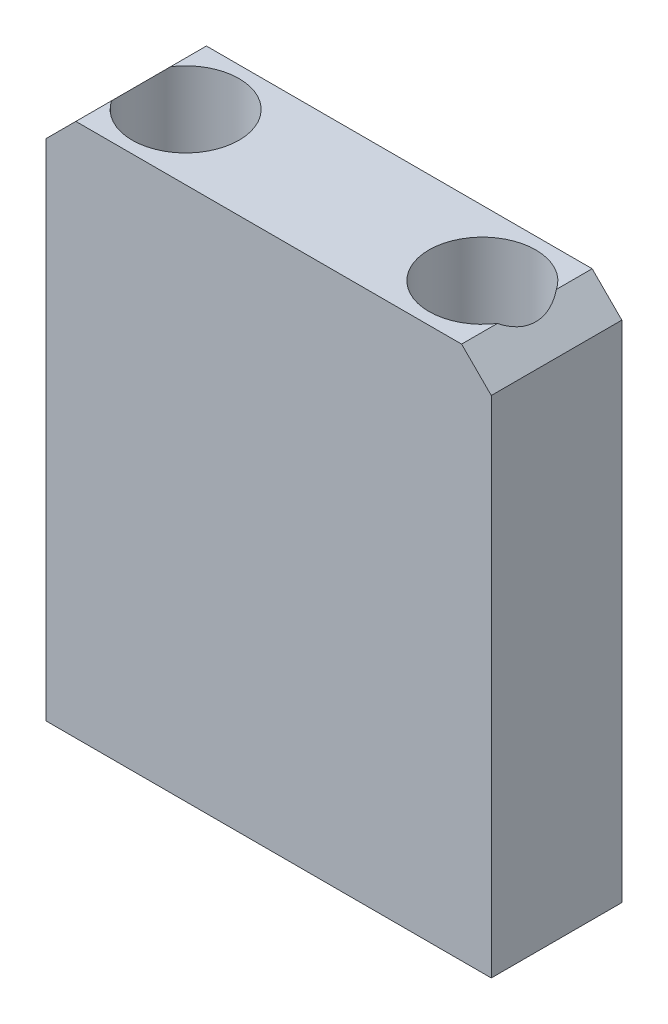
ISO-10303-21;
HEADER;
FILE_DESCRIPTION(('STEP AP214'),'2;1');
FILE_NAME('part.step','',(''),(''),'','','');
FILE_SCHEMA(('AUTOMOTIVE_DESIGN { 1 0 10303 214 1 1 1 1 }'));
ENDSEC;
DATA;
#1=APPLICATION_CONTEXT('core data for automotive mechanical design processes');
#2=APPLICATION_PROTOCOL_DEFINITION('international standard','automotive_design',2000,#1);
#3=PRODUCT_CONTEXT('',#1,'mechanical');
#4=PRODUCT('Part','Part','',(#3));
#5=PRODUCT_RELATED_PRODUCT_CATEGORY('part','',(#4));
#6=PRODUCT_DEFINITION_FORMATION('','',#4);
#7=PRODUCT_DEFINITION_CONTEXT('part definition',#1,'design');
#8=PRODUCT_DEFINITION('design','',#6,#7);
#9=PRODUCT_DEFINITION_SHAPE('','',#8);
#10=(LENGTH_UNIT() NAMED_UNIT(*) SI_UNIT(.MILLI.,.METRE.));
#11=(NAMED_UNIT(*) PLANE_ANGLE_UNIT() SI_UNIT($,.RADIAN.));
#12=(NAMED_UNIT(*) SI_UNIT($,.STERADIAN.) SOLID_ANGLE_UNIT());
#13=UNCERTAINTY_MEASURE_WITH_UNIT(LENGTH_MEASURE(1.E-05),#10,'distance_accuracy_value','');
#14=(GEOMETRIC_REPRESENTATION_CONTEXT(3) GLOBAL_UNCERTAINTY_ASSIGNED_CONTEXT((#13)) GLOBAL_UNIT_ASSIGNED_CONTEXT((#10,
#11,#12)) REPRESENTATION_CONTEXT('',''));
#15=CARTESIAN_POINT('',(0.,0.,0.));
#16=DIRECTION('',(0.,0.,1.));
#17=DIRECTION('',(1.,0.,0.));
#18=AXIS2_PLACEMENT_3D('',#15,#16,#17);
#19=CARTESIAN_POINT('',(-37.5,0.,22.));
#20=DIRECTION('',(1.,0.,0.));
#21=DIRECTION('',(0.,0.,-1.));
#22=AXIS2_PLACEMENT_3D('',#19,#20,#21);
#23=PLANE('',#22);
#24=DIRECTION('',(0.,-1.,0.));
#25=VECTOR('',#24,1.);
#26=CARTESIAN_POINT('',(-37.5,0.,22.));
#27=LINE('',#26,#25);
#28=CARTESIAN_POINT('',(-37.5,84.9999999999999,22.));
#29=VERTEX_POINT('',#28);
#30=CARTESIAN_POINT('',(-37.5,0.,22.));
#31=VERTEX_POINT('',#30);
#32=EDGE_CURVE('E98',#29,#31,#27,.T.);
#33=ORIENTED_EDGE('',*,*,#32,.F.);
#34=DIRECTION('',(0.,0.,-1.));
#35=VECTOR('',#34,1.);
#36=CARTESIAN_POINT('',(-37.5,84.9999999999999,22.));
#37=LINE('',#36,#35);
#38=CARTESIAN_POINT('',(-37.5,84.9999999999999,0.));
#39=VERTEX_POINT('',#38);
#40=EDGE_CURVE('E122',#29,#39,#37,.T.);
#41=ORIENTED_EDGE('',*,*,#40,.T.);
#42=DIRECTION('',(0.,-1.,0.));
#43=VECTOR('',#42,1.);
#44=CARTESIAN_POINT('',(-37.5,0.,0.));
#45=LINE('',#44,#43);
#46=CARTESIAN_POINT('',(-37.5,0.,0.));
#47=VERTEX_POINT('',#46);
#48=EDGE_CURVE('E120',#39,#47,#45,.T.);
#49=ORIENTED_EDGE('',*,*,#48,.T.);
#50=DIRECTION('',(0.,0.,-1.));
#51=VECTOR('',#50,1.);
#52=CARTESIAN_POINT('',(-37.5,0.,22.));
#53=LINE('',#52,#51);
#54=EDGE_CURVE('E114',#31,#47,#53,.T.);
#55=ORIENTED_EDGE('',*,*,#54,.F.);
#56=EDGE_LOOP('',(#33,#41,#49,#55));
#57=FACE_BOUND('',#56,.T.);
#58=ADVANCED_FACE('F32',(#57),#23,.F.);
#59=CARTESIAN_POINT('',(-37.5,0.,22.));
#60=DIRECTION('',(0.,1.,0.));
#61=DIRECTION('',(0.,0.,1.));
#62=AXIS2_PLACEMENT_3D('',#59,#60,#61);
#63=PLANE('',#62);
#64=CARTESIAN_POINT('',(-25.,0.,11.));
#65=DIRECTION('',(0.,1.,0.));
#66=DIRECTION('',(0.,0.,1.));
#67=AXIS2_PLACEMENT_3D('',#64,#65,#66);
#68=CIRCLE('',#67,5.99999999999998);
#69=CARTESIAN_POINT('',(-25.,0.,17.));
#70=VERTEX_POINT('',#69);
#71=EDGE_CURVE('E157',#70,#70,#68,.T.);
#72=ORIENTED_EDGE('',*,*,#71,.T.);
#73=EDGE_LOOP('',(#72));
#74=FACE_BOUND('',#73,.T.);
#75=CARTESIAN_POINT('',(25.,0.,11.));
#76=DIRECTION('',(0.,1.,0.));
#77=DIRECTION('',(0.,0.,1.));
#78=AXIS2_PLACEMENT_3D('',#75,#76,#77);
#79=CIRCLE('',#78,5.99999999999998);
#80=CARTESIAN_POINT('',(25.,0.,17.));
#81=VERTEX_POINT('',#80);
#82=EDGE_CURVE('E171',#81,#81,#79,.T.);
#83=ORIENTED_EDGE('',*,*,#82,.T.);
#84=EDGE_LOOP('',(#83));
#85=FACE_BOUND('',#84,.T.);
#86=DIRECTION('',(1.,0.,0.));
#87=VECTOR('',#86,1.);
#88=CARTESIAN_POINT('',(-37.5,0.,0.));
#89=LINE('',#88,#87);
#90=CARTESIAN_POINT('',(37.5,0.,0.));
#91=VERTEX_POINT('',#90);
#92=EDGE_CURVE('E166',#47,#91,#89,.T.);
#93=ORIENTED_EDGE('',*,*,#92,.T.);
#94=DIRECTION('',(0.,0.,-1.));
#95=VECTOR('',#94,1.);
#96=CARTESIAN_POINT('',(37.5,0.,22.));
#97=LINE('',#96,#95);
#98=CARTESIAN_POINT('',(37.5,0.,22.));
#99=VERTEX_POINT('',#98);
#100=EDGE_CURVE('E116',#99,#91,#97,.T.);
#101=ORIENTED_EDGE('',*,*,#100,.F.);
#102=DIRECTION('',(1.,0.,0.));
#103=VECTOR('',#102,1.);
#104=CARTESIAN_POINT('',(-37.5,0.,22.));
#105=LINE('',#104,#103);
#106=EDGE_CURVE('E101',#31,#99,#105,.T.);
#107=ORIENTED_EDGE('',*,*,#106,.F.);
#108=ORIENTED_EDGE('',*,*,#54,.T.);
#109=EDGE_LOOP('',(#93,#101,#107,#108));
#110=FACE_BOUND('',#109,.T.);
#111=ADVANCED_FACE('F113',(#74,#85,#110),#63,.F.);
#112=CARTESIAN_POINT('',(37.5,0.,22.));
#113=DIRECTION('',(-1.,0.,0.));
#114=DIRECTION('',(0.,0.,1.));
#115=AXIS2_PLACEMENT_3D('',#112,#113,#114);
#116=PLANE('',#115);
#117=DIRECTION('',(0.,1.,0.));
#118=VECTOR('',#117,1.);
#119=CARTESIAN_POINT('',(37.5,0.,0.));
#120=LINE('',#119,#118);
#121=CARTESIAN_POINT('',(37.5,84.9999999999999,0.));
#122=VERTEX_POINT('',#121);
#123=EDGE_CURVE('E164',#91,#122,#120,.T.);
#124=ORIENTED_EDGE('',*,*,#123,.T.);
#125=DIRECTION('',(0.,0.,1.));
#126=VECTOR('',#125,1.);
#127=CARTESIAN_POINT('',(37.5,85.,22.));
#128=LINE('',#127,#126);
#129=CARTESIAN_POINT('',(37.5,85.,22.));
#130=VERTEX_POINT('',#129);
#131=EDGE_CURVE('E11',#122,#130,#128,.T.);
#132=ORIENTED_EDGE('',*,*,#131,.T.);
#133=DIRECTION('',(0.,1.,0.));
#134=VECTOR('',#133,1.);
#135=CARTESIAN_POINT('',(37.5,0.,22.));
#136=LINE('',#135,#134);
#137=EDGE_CURVE('E117',#99,#130,#136,.T.);
#138=ORIENTED_EDGE('',*,*,#137,.F.);
#139=ORIENTED_EDGE('',*,*,#100,.T.);
#140=EDGE_LOOP('',(#124,#132,#138,#139));
#141=FACE_BOUND('',#140,.T.);
#142=ADVANCED_FACE('F165',(#141),#116,.F.);
#143=CARTESIAN_POINT('',(-37.5,90.,22.));
#144=DIRECTION('',(0.,-1.,0.));
#145=DIRECTION('',(0.,0.,-1.));
#146=AXIS2_PLACEMENT_3D('',#143,#144,#145);
#147=PLANE('',#146);
#148=DIRECTION('',(-1.,0.,0.));
#149=VECTOR('',#148,1.);
#150=CARTESIAN_POINT('',(-37.5,90.,0.));
#151=LINE('',#150,#149);
#152=CARTESIAN_POINT('',(32.4999999999999,90.,0.));
#153=VERTEX_POINT('',#152);
#154=CARTESIAN_POINT('',(-32.5,90.,0.));
#155=VERTEX_POINT('',#154);
#156=EDGE_CURVE('E109',#153,#155,#151,.T.);
#157=ORIENTED_EDGE('',*,*,#156,.T.);
#158=DIRECTION('',(0.,0.,1.));
#159=VECTOR('',#158,1.);
#160=CARTESIAN_POINT('',(-32.5,90.,22.));
#161=LINE('',#160,#159);
#162=CARTESIAN_POINT('',(-32.5,90.,6.02506281446684));
#163=VERTEX_POINT('',#162);
#164=EDGE_CURVE('E139',#155,#163,#161,.T.);
#165=ORIENTED_EDGE('',*,*,#164,.T.);
#166=CARTESIAN_POINT('',(-25.,90.,11.));
#167=DIRECTION('',(0.,1.,0.));
#168=DIRECTION('',(0.,0.,1.));
#169=AXIS2_PLACEMENT_3D('',#166,#167,#168);
#170=CIRCLE('',#169,9.);
#171=CARTESIAN_POINT('',(-32.5,90.,15.9749371855332));
#172=VERTEX_POINT('',#171);
#173=EDGE_CURVE('E189',#172,#163,#170,.T.);
#174=ORIENTED_EDGE('',*,*,#173,.F.);
#175=DIRECTION('',(0.,0.,1.));
#176=VECTOR('',#175,1.);
#177=CARTESIAN_POINT('',(-32.5,90.,22.));
#178=LINE('',#177,#176);
#179=CARTESIAN_POINT('',(-32.5,90.,22.));
#180=VERTEX_POINT('',#179);
#181=EDGE_CURVE('E53',#172,#180,#178,.T.);
#182=ORIENTED_EDGE('',*,*,#181,.T.);
#183=DIRECTION('',(-1.,0.,0.));
#184=VECTOR('',#183,1.);
#185=CARTESIAN_POINT('',(-37.5,90.,22.));
#186=LINE('',#185,#184);
#187=CARTESIAN_POINT('',(32.4999999999999,90.,22.));
#188=VERTEX_POINT('',#187);
#189=EDGE_CURVE('E126',#188,#180,#186,.T.);
#190=ORIENTED_EDGE('',*,*,#189,.F.);
#191=DIRECTION('',(0.,0.,-1.));
#192=VECTOR('',#191,1.);
#193=CARTESIAN_POINT('',(32.4999999999999,90.,22.));
#194=LINE('',#193,#192);
#195=CARTESIAN_POINT('',(32.4999999999999,90.,15.9749371855333));
#196=VERTEX_POINT('',#195);
#197=EDGE_CURVE('E135',#188,#196,#194,.T.);
#198=ORIENTED_EDGE('',*,*,#197,.T.);
#199=CARTESIAN_POINT('',(25.,90.,11.));
#200=DIRECTION('',(0.,1.,0.));
#201=DIRECTION('',(0.,0.,1.));
#202=AXIS2_PLACEMENT_3D('',#199,#200,#201);
#203=CIRCLE('',#202,9.);
#204=CARTESIAN_POINT('',(32.4999999999999,90.,6.02506281446676));
#205=VERTEX_POINT('',#204);
#206=EDGE_CURVE('E149',#205,#196,#203,.T.);
#207=ORIENTED_EDGE('',*,*,#206,.F.);
#208=DIRECTION('',(0.,0.,-1.));
#209=VECTOR('',#208,1.);
#210=CARTESIAN_POINT('',(32.4999999999999,90.,22.));
#211=LINE('',#210,#209);
#212=EDGE_CURVE('E133',#205,#153,#211,.T.);
#213=ORIENTED_EDGE('',*,*,#212,.T.);
#214=EDGE_LOOP('',(#157,#165,#174,#182,#190,#198,#207,#213));
#215=FACE_BOUND('',#214,.T.);
#216=ADVANCED_FACE('F154',(#215),#147,.F.);
#217=CARTESIAN_POINT('',(-37.5,90.,22.));
#218=DIRECTION('',(0.,0.,-1.));
#219=DIRECTION('',(-1.,0.,0.));
#220=AXIS2_PLACEMENT_3D('',#217,#218,#219);
#221=PLANE('',#220);
#222=ORIENTED_EDGE('',*,*,#189,.T.);
#223=DIRECTION('',(0.707106781186544,0.707106781186551,0.));
#224=VECTOR('',#223,1.);
#225=CARTESIAN_POINT('',(-37.5,84.9999999999999,22.));
#226=LINE('',#225,#224);
#227=EDGE_CURVE('E104',#180,#29,#226,.F.);
#228=ORIENTED_EDGE('',*,*,#227,.T.);
#229=ORIENTED_EDGE('',*,*,#32,.T.);
#230=ORIENTED_EDGE('',*,*,#106,.T.);
#231=ORIENTED_EDGE('',*,*,#137,.T.);
#232=DIRECTION('',(0.707106781186551,-0.707106781186544,0.));
#233=VECTOR('',#232,1.);
#234=CARTESIAN_POINT('',(32.4999999999999,90.,22.));
#235=LINE('',#234,#233);
#236=EDGE_CURVE('E143',#130,#188,#235,.F.);
#237=ORIENTED_EDGE('',*,*,#236,.T.);
#238=EDGE_LOOP('',(#222,#228,#229,#230,#231,#237));
#239=FACE_BOUND('',#238,.T.);
#240=ADVANCED_FACE('F100',(#239),#221,.F.);
#241=CARTESIAN_POINT('',(-37.5,90.,0.));
#242=DIRECTION('',(0.,0.,-1.));
#243=DIRECTION('',(-1.,0.,0.));
#244=AXIS2_PLACEMENT_3D('',#241,#242,#243);
#245=PLANE('',#244);
#246=ORIENTED_EDGE('',*,*,#48,.F.);
#247=DIRECTION('',(-0.707106781186544,-0.707106781186551,0.));
#248=VECTOR('',#247,1.);
#249=CARTESIAN_POINT('',(-35.,87.5,0.));
#250=LINE('',#249,#248);
#251=EDGE_CURVE('E131',#39,#155,#250,.F.);
#252=ORIENTED_EDGE('',*,*,#251,.T.);
#253=ORIENTED_EDGE('',*,*,#156,.F.);
#254=DIRECTION('',(-0.707106781186551,0.707106781186544,0.));
#255=VECTOR('',#254,1.);
#256=CARTESIAN_POINT('',(-2.50000000000043,125.,0.));
#257=LINE('',#256,#255);
#258=EDGE_CURVE('E124',#153,#122,#257,.F.);
#259=ORIENTED_EDGE('',*,*,#258,.T.);
#260=ORIENTED_EDGE('',*,*,#123,.F.);
#261=ORIENTED_EDGE('',*,*,#92,.F.);
#262=EDGE_LOOP('',(#246,#252,#253,#259,#260,#261));
#263=FACE_BOUND('',#262,.T.);
#264=ADVANCED_FACE('F163',(#263),#245,.T.);
#265=CARTESIAN_POINT('',(25.,90.,11.));
#266=DIRECTION('',(0.,1.,0.));
#267=DIRECTION('',(0.,0.,1.));
#268=AXIS2_PLACEMENT_3D('',#265,#266,#267);
#269=CYLINDRICAL_SURFACE('',#268,5.99999999999999);
#270=ORIENTED_EDGE('',*,*,#82,.F.);
#271=EDGE_LOOP('',(#270));
#272=FACE_BOUND('',#271,.T.);
#273=CARTESIAN_POINT('',(25.,59.,11.));
#274=DIRECTION('',(0.,1.,0.));
#275=DIRECTION('',(0.,0.,1.));
#276=AXIS2_PLACEMENT_3D('',#273,#274,#275);
#277=CIRCLE('',#276,6.);
#278=CARTESIAN_POINT('',(25.,59.,17.));
#279=VERTEX_POINT('',#278);
#280=EDGE_CURVE('E176',#279,#279,#277,.T.);
#281=ORIENTED_EDGE('',*,*,#280,.T.);
#282=EDGE_LOOP('',(#281));
#283=FACE_BOUND('',#282,.T.);
#284=ADVANCED_FACE('F219',(#272,#283),#269,.F.);
#285=CARTESIAN_POINT('',(31.,59.,11.));
#286=DIRECTION('',(0.,-1.,0.));
#287=DIRECTION('',(0.,0.,-1.));
#288=AXIS2_PLACEMENT_3D('',#285,#286,#287);
#289=PLANE('',#288);
#290=ORIENTED_EDGE('',*,*,#280,.F.);
#291=EDGE_LOOP('',(#290));
#292=FACE_BOUND('',#291,.T.);
#293=CARTESIAN_POINT('',(25.,59.,11.));
#294=DIRECTION('',(0.,1.,0.));
#295=DIRECTION('',(0.,0.,1.));
#296=AXIS2_PLACEMENT_3D('',#293,#294,#295);
#297=CIRCLE('',#296,8.99999999999999);
#298=CARTESIAN_POINT('',(25.,59.,20.));
#299=VERTEX_POINT('',#298);
#300=EDGE_CURVE('E156',#299,#299,#297,.T.);
#301=ORIENTED_EDGE('',*,*,#300,.T.);
#302=EDGE_LOOP('',(#301));
#303=FACE_BOUND('',#302,.T.);
#304=ADVANCED_FACE('F224',(#292,#303),#289,.F.);
#305=CARTESIAN_POINT('',(25.,90.,11.));
#306=DIRECTION('',(0.,1.,0.));
#307=DIRECTION('',(0.,0.,1.));
#308=AXIS2_PLACEMENT_3D('',#305,#306,#307);
#309=CYLINDRICAL_SURFACE('',#308,9.);
#310=ORIENTED_EDGE('',*,*,#300,.F.);
#311=EDGE_LOOP('',(#310));
#312=FACE_BOUND('',#311,.T.);
#313=ORIENTED_EDGE('',*,*,#206,.T.);
#314=CARTESIAN_POINT('',(25.,97.4999999999998,11.));
#315=DIRECTION('',(-0.707106781186544,-0.707106781186551,0.));
#316=DIRECTION('',(-0.707106781186551,0.707106781186544,0.));
#317=AXIS2_PLACEMENT_3D('',#314,#315,#316);
#318=ELLIPSE('',#317,12.7279220613578,9.);
#319=EDGE_CURVE('E40',#196,#205,#318,.F.);
#320=ORIENTED_EDGE('',*,*,#319,.T.);
#321=EDGE_LOOP('',(#313,#320));
#322=FACE_BOUND('',#321,.T.);
#323=ADVANCED_FACE('F148',(#312,#322),#309,.F.);
#324=CARTESIAN_POINT('',(-25.,90.,11.));
#325=DIRECTION('',(0.,1.,0.));
#326=DIRECTION('',(0.,0.,1.));
#327=AXIS2_PLACEMENT_3D('',#324,#325,#326);
#328=CYLINDRICAL_SURFACE('',#327,5.99999999999999);
#329=ORIENTED_EDGE('',*,*,#71,.F.);
#330=EDGE_LOOP('',(#329));
#331=FACE_BOUND('',#330,.T.);
#332=CARTESIAN_POINT('',(-25.,59.,11.));
#333=DIRECTION('',(0.,1.,0.));
#334=DIRECTION('',(0.,0.,1.));
#335=AXIS2_PLACEMENT_3D('',#332,#333,#334);
#336=CIRCLE('',#335,6.);
#337=CARTESIAN_POINT('',(-25.,59.,17.));
#338=VERTEX_POINT('',#337);
#339=EDGE_CURVE('E183',#338,#338,#336,.T.);
#340=ORIENTED_EDGE('',*,*,#339,.T.);
#341=EDGE_LOOP('',(#340));
#342=FACE_BOUND('',#341,.T.);
#343=ADVANCED_FACE('F231',(#331,#342),#328,.F.);
#344=CARTESIAN_POINT('',(-19.,59.,11.));
#345=DIRECTION('',(0.,-1.,0.));
#346=DIRECTION('',(0.,0.,-1.));
#347=AXIS2_PLACEMENT_3D('',#344,#345,#346);
#348=PLANE('',#347);
#349=ORIENTED_EDGE('',*,*,#339,.F.);
#350=EDGE_LOOP('',(#349));
#351=FACE_BOUND('',#350,.T.);
#352=CARTESIAN_POINT('',(-25.,59.,11.));
#353=DIRECTION('',(0.,1.,0.));
#354=DIRECTION('',(0.,0.,1.));
#355=AXIS2_PLACEMENT_3D('',#352,#353,#354);
#356=CIRCLE('',#355,8.99999999999999);
#357=CARTESIAN_POINT('',(-25.,59.,20.));
#358=VERTEX_POINT('',#357);
#359=EDGE_CURVE('E186',#358,#358,#356,.T.);
#360=ORIENTED_EDGE('',*,*,#359,.T.);
#361=EDGE_LOOP('',(#360));
#362=FACE_BOUND('',#361,.T.);
#363=ADVANCED_FACE('F202',(#351,#362),#348,.F.);
#364=CARTESIAN_POINT('',(-25.,90.,11.));
#365=DIRECTION('',(0.,1.,0.));
#366=DIRECTION('',(0.,0.,1.));
#367=AXIS2_PLACEMENT_3D('',#364,#365,#366);
#368=CYLINDRICAL_SURFACE('',#367,9.);
#369=ORIENTED_EDGE('',*,*,#359,.F.);
#370=EDGE_LOOP('',(#369));
#371=FACE_BOUND('',#370,.T.);
#372=ORIENTED_EDGE('',*,*,#173,.T.);
#373=CARTESIAN_POINT('',(-25.,97.5,11.));
#374=DIRECTION('',(0.707106781186551,-0.707106781186544,0.));
#375=DIRECTION('',(0.707106781186544,0.707106781186551,0.));
#376=AXIS2_PLACEMENT_3D('',#373,#374,#375);
#377=ELLIPSE('',#376,12.7279220613579,9.);
#378=EDGE_CURVE('E141',#163,#172,#377,.F.);
#379=ORIENTED_EDGE('',*,*,#378,.T.);
#380=EDGE_LOOP('',(#372,#379));
#381=FACE_BOUND('',#380,.T.);
#382=ADVANCED_FACE('F193',(#371,#381),#368,.F.);
#383=CARTESIAN_POINT('',(-37.5,84.9999999999999,22.));
#384=DIRECTION('',(0.707106781186551,-0.707106781186544,0.));
#385=DIRECTION('',(0.707106781186544,0.707106781186551,0.));
#386=AXIS2_PLACEMENT_3D('',#383,#384,#385);
#387=PLANE('',#386);
#388=ORIENTED_EDGE('',*,*,#378,.F.);
#389=ORIENTED_EDGE('',*,*,#164,.F.);
#390=ORIENTED_EDGE('',*,*,#251,.F.);
#391=ORIENTED_EDGE('',*,*,#40,.F.);
#392=ORIENTED_EDGE('',*,*,#227,.F.);
#393=ORIENTED_EDGE('',*,*,#181,.F.);
#394=EDGE_LOOP('',(#388,#389,#390,#391,#392,#393));
#395=FACE_BOUND('',#394,.T.);
#396=ADVANCED_FACE('F196',(#395),#387,.F.);
#397=CARTESIAN_POINT('',(32.4999999999999,90.,22.));
#398=DIRECTION('',(-0.707106781186544,-0.707106781186551,0.));
#399=DIRECTION('',(0.707106781186551,-0.707106781186544,0.));
#400=AXIS2_PLACEMENT_3D('',#397,#398,#399);
#401=PLANE('',#400);
#402=ORIENTED_EDGE('',*,*,#236,.F.);
#403=ORIENTED_EDGE('',*,*,#131,.F.);
#404=ORIENTED_EDGE('',*,*,#258,.F.);
#405=ORIENTED_EDGE('',*,*,#212,.F.);
#406=ORIENTED_EDGE('',*,*,#319,.F.);
#407=ORIENTED_EDGE('',*,*,#197,.F.);
#408=EDGE_LOOP('',(#402,#403,#404,#405,#406,#407));
#409=FACE_BOUND('',#408,.T.);
#410=ADVANCED_FACE('F34',(#409),#401,.F.);
#411=CLOSED_SHELL('',(#58,#111,#142,#216,#240,#264,#284,#304,#323,#343,#363,#382,#396,#410));
#412=MANIFOLD_SOLID_BREP('B2',#411);
#413=ADVANCED_BREP_SHAPE_REPRESENTATION('',(#18,#412),#14);
#414=SHAPE_DEFINITION_REPRESENTATION(#9,#413);
ENDSEC;
END-ISO-10303-21;
